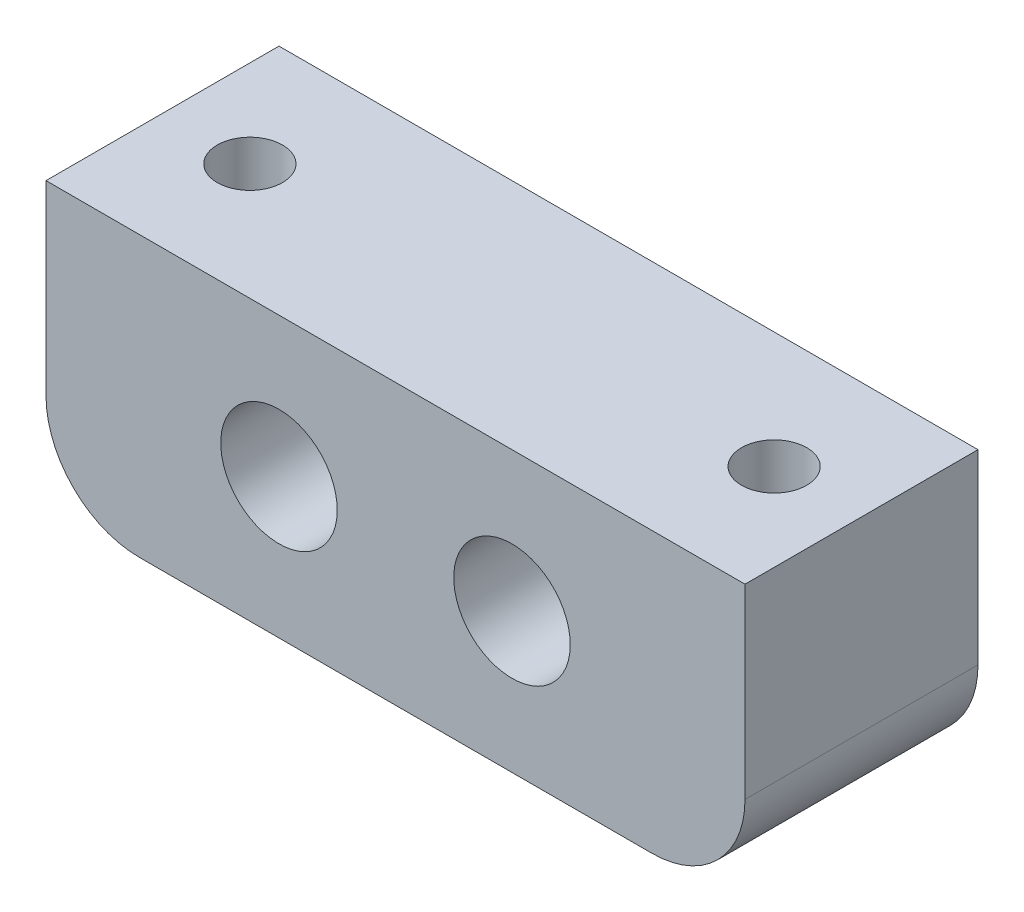
ISO-10303-21;
HEADER;
FILE_DESCRIPTION(('STEP AP214'),'2;1');
FILE_NAME('part.step','',(''),(''),'','','');
FILE_SCHEMA(('AUTOMOTIVE_DESIGN { 1 0 10303 214 1 1 1 1 }'));
ENDSEC;
DATA;
#1=APPLICATION_CONTEXT('core data for automotive mechanical design processes');
#2=APPLICATION_PROTOCOL_DEFINITION('international standard','automotive_design',2000,#1);
#3=PRODUCT_CONTEXT('',#1,'mechanical');
#4=PRODUCT('Part','Part','',(#3));
#5=PRODUCT_RELATED_PRODUCT_CATEGORY('part','',(#4));
#6=PRODUCT_DEFINITION_FORMATION('','',#4);
#7=PRODUCT_DEFINITION_CONTEXT('part definition',#1,'design');
#8=PRODUCT_DEFINITION('design','',#6,#7);
#9=PRODUCT_DEFINITION_SHAPE('','',#8);
#10=(LENGTH_UNIT() NAMED_UNIT(*) SI_UNIT(.MILLI.,.METRE.));
#11=(NAMED_UNIT(*) PLANE_ANGLE_UNIT() SI_UNIT($,.RADIAN.));
#12=(NAMED_UNIT(*) SI_UNIT($,.STERADIAN.) SOLID_ANGLE_UNIT());
#13=UNCERTAINTY_MEASURE_WITH_UNIT(LENGTH_MEASURE(1.E-05),#10,'distance_accuracy_value','');
#14=(GEOMETRIC_REPRESENTATION_CONTEXT(3) GLOBAL_UNCERTAINTY_ASSIGNED_CONTEXT((#13)) GLOBAL_UNIT_ASSIGNED_CONTEXT((#10,
#11,#12)) REPRESENTATION_CONTEXT('',''));
#15=CARTESIAN_POINT('',(0.,0.,0.));
#16=DIRECTION('',(0.,0.,1.));
#17=DIRECTION('',(1.,0.,0.));
#18=AXIS2_PLACEMENT_3D('',#15,#16,#17);
#19=CARTESIAN_POINT('',(-3.65320491734623,-5.17350013380129,6.35));
#20=DIRECTION('',(0.,0.,1.));
#21=DIRECTION('',(1.,0.,0.));
#22=AXIS2_PLACEMENT_3D('',#19,#20,#21);
#23=PLANE('',#22);
#24=CARTESIAN_POINT('',(0.15679508265377,-3.90350013380129,6.35));
#25=DIRECTION('',(0.,0.,1.));
#26=DIRECTION('',(1.,0.,0.));
#27=AXIS2_PLACEMENT_3D('',#24,#25,#26);
#28=CIRCLE('',#27,1.5875);
#29=CARTESIAN_POINT('',(1.74429508265377,-3.90350013380129,6.35));
#30=VERTEX_POINT('',#29);
#31=EDGE_CURVE('E122',#30,#30,#28,.T.);
#32=ORIENTED_EDGE('',*,*,#31,.F.);
#33=EDGE_LOOP('',(#32));
#34=FACE_BOUND('',#33,.T.);
#35=DIRECTION('',(0.,-1.,0.));
#36=VECTOR('',#35,1.);
#37=CARTESIAN_POINT('',(-6.19320491734623,-0.0935001338012867,6.35));
#38=LINE('',#37,#36);
#39=CARTESIAN_POINT('',(-6.19320491734623,-0.0935001338012867,6.35));
#40=VERTEX_POINT('',#39);
#41=CARTESIAN_POINT('',(-6.19320491734623,-5.17350013380127,6.35));
#42=VERTEX_POINT('',#41);
#43=EDGE_CURVE('E129',#40,#42,#38,.T.);
#44=ORIENTED_EDGE('',*,*,#43,.T.);
#45=CARTESIAN_POINT('',(-3.65320491734623,-5.17350013380129,6.35));
#46=DIRECTION('',(0.,0.,1.));
#47=DIRECTION('',(1.,0.,0.));
#48=AXIS2_PLACEMENT_3D('',#45,#46,#47);
#49=CIRCLE('',#48,2.54);
#50=CARTESIAN_POINT('',(-3.65320491734621,-7.71350013380129,6.35));
#51=VERTEX_POINT('',#50);
#52=EDGE_CURVE('E87',#42,#51,#49,.T.);
#53=ORIENTED_EDGE('',*,*,#52,.T.);
#54=DIRECTION('',(1.,0.,0.));
#55=VECTOR('',#54,1.);
#56=CARTESIAN_POINT('',(-3.65320491734621,-7.71350013380129,6.35));
#57=LINE('',#56,#55);
#58=CARTESIAN_POINT('',(10.3167950826538,-7.71350013380129,6.35));
#59=VERTEX_POINT('',#58);
#60=EDGE_CURVE('E100',#51,#59,#57,.T.);
#61=ORIENTED_EDGE('',*,*,#60,.T.);
#62=CARTESIAN_POINT('',(10.3167950826538,-5.17350013380129,6.35));
#63=DIRECTION('',(0.,0.,1.));
#64=DIRECTION('',(1.,0.,0.));
#65=AXIS2_PLACEMENT_3D('',#62,#63,#64);
#66=CIRCLE('',#65,2.54);
#67=CARTESIAN_POINT('',(12.8567950826538,-5.17350013380127,6.35));
#68=VERTEX_POINT('',#67);
#69=EDGE_CURVE('E94',#59,#68,#66,.T.);
#70=ORIENTED_EDGE('',*,*,#69,.T.);
#71=DIRECTION('',(0.,1.,0.));
#72=VECTOR('',#71,1.);
#73=CARTESIAN_POINT('',(12.8567950826538,-0.0935001338012876,6.35));
#74=LINE('',#73,#72);
#75=CARTESIAN_POINT('',(12.8567950826538,-0.0935001338012876,6.35));
#76=VERTEX_POINT('',#75);
#77=EDGE_CURVE('E98',#68,#76,#74,.T.);
#78=ORIENTED_EDGE('',*,*,#77,.T.);
#79=DIRECTION('',(-1.,0.,0.));
#80=VECTOR('',#79,1.);
#81=CARTESIAN_POINT('',(-6.19320491734623,-0.0935001338012867,6.35));
#82=LINE('',#81,#80);
#83=EDGE_CURVE('E50',#76,#40,#82,.T.);
#84=ORIENTED_EDGE('',*,*,#83,.T.);
#85=EDGE_LOOP('',(#44,#53,#61,#70,#78,#84));
#86=FACE_BOUND('',#85,.T.);
#87=CARTESIAN_POINT('',(6.50679508265377,-3.90350013380129,6.35));
#88=DIRECTION('',(0.,0.,1.));
#89=DIRECTION('',(1.,0.,0.));
#90=AXIS2_PLACEMENT_3D('',#87,#88,#89);
#91=CIRCLE('',#90,1.5875);
#92=CARTESIAN_POINT('',(8.09429508265377,-3.90350013380129,6.35));
#93=VERTEX_POINT('',#92);
#94=EDGE_CURVE('E203',#93,#93,#91,.T.);
#95=ORIENTED_EDGE('',*,*,#94,.F.);
#96=EDGE_LOOP('',(#95));
#97=FACE_BOUND('',#96,.T.);
#98=ADVANCED_FACE('F33',(#34,#86,#97),#23,.T.);
#99=CARTESIAN_POINT('',(-3.65320491734623,-5.17350013380129,0.));
#100=DIRECTION('',(0.,0.,1.));
#101=DIRECTION('',(1.,0.,0.));
#102=AXIS2_PLACEMENT_3D('',#99,#100,#101);
#103=PLANE('',#102);
#104=CARTESIAN_POINT('',(0.15679508265377,-3.90350013380129,0.));
#105=DIRECTION('',(0.,0.,1.));
#106=DIRECTION('',(1.,0.,0.));
#107=AXIS2_PLACEMENT_3D('',#104,#105,#106);
#108=CIRCLE('',#107,1.5875);
#109=CARTESIAN_POINT('',(1.74429508265377,-3.90350013380129,0.));
#110=VERTEX_POINT('',#109);
#111=EDGE_CURVE('E206',#110,#110,#108,.T.);
#112=ORIENTED_EDGE('',*,*,#111,.T.);
#113=EDGE_LOOP('',(#112));
#114=FACE_BOUND('',#113,.T.);
#115=DIRECTION('',(0.,-1.,0.));
#116=VECTOR('',#115,1.);
#117=CARTESIAN_POINT('',(-6.19320491734623,-0.0935001338012867,0.));
#118=LINE('',#117,#116);
#119=CARTESIAN_POINT('',(-6.19320491734623,-0.0935001338012867,0.));
#120=VERTEX_POINT('',#119);
#121=CARTESIAN_POINT('',(-6.19320491734623,-5.17350013380127,0.));
#122=VERTEX_POINT('',#121);
#123=EDGE_CURVE('E118',#120,#122,#118,.T.);
#124=ORIENTED_EDGE('',*,*,#123,.F.);
#125=DIRECTION('',(-1.,0.,0.));
#126=VECTOR('',#125,1.);
#127=CARTESIAN_POINT('',(-6.19320491734623,-0.0935001338012867,0.));
#128=LINE('',#127,#126);
#129=CARTESIAN_POINT('',(12.8567950826538,-0.0935001338012876,0.));
#130=VERTEX_POINT('',#129);
#131=EDGE_CURVE('E79',#130,#120,#128,.T.);
#132=ORIENTED_EDGE('',*,*,#131,.F.);
#133=DIRECTION('',(0.,1.,0.));
#134=VECTOR('',#133,1.);
#135=CARTESIAN_POINT('',(12.8567950826538,-0.0935001338012876,0.));
#136=LINE('',#135,#134);
#137=CARTESIAN_POINT('',(12.8567950826538,-5.17350013380127,0.));
#138=VERTEX_POINT('',#137);
#139=EDGE_CURVE('E73',#138,#130,#136,.T.);
#140=ORIENTED_EDGE('',*,*,#139,.F.);
#141=CARTESIAN_POINT('',(10.3167950826538,-5.17350013380129,0.));
#142=DIRECTION('',(0.,0.,1.));
#143=DIRECTION('',(1.,0.,0.));
#144=AXIS2_PLACEMENT_3D('',#141,#142,#143);
#145=CIRCLE('',#144,2.54);
#146=CARTESIAN_POINT('',(10.3167950826538,-7.71350013380129,0.));
#147=VERTEX_POINT('',#146);
#148=EDGE_CURVE('E108',#147,#138,#145,.T.);
#149=ORIENTED_EDGE('',*,*,#148,.F.);
#150=DIRECTION('',(1.,0.,0.));
#151=VECTOR('',#150,1.);
#152=CARTESIAN_POINT('',(-3.65320491734621,-7.71350013380129,0.));
#153=LINE('',#152,#151);
#154=CARTESIAN_POINT('',(-3.65320491734621,-7.71350013380129,0.));
#155=VERTEX_POINT('',#154);
#156=EDGE_CURVE('E124',#155,#147,#153,.T.);
#157=ORIENTED_EDGE('',*,*,#156,.F.);
#158=CARTESIAN_POINT('',(-3.65320491734623,-5.17350013380129,0.));
#159=DIRECTION('',(0.,0.,1.));
#160=DIRECTION('',(1.,0.,0.));
#161=AXIS2_PLACEMENT_3D('',#158,#159,#160);
#162=CIRCLE('',#161,2.54);
#163=EDGE_CURVE('E121',#122,#155,#162,.T.);
#164=ORIENTED_EDGE('',*,*,#163,.F.);
#165=EDGE_LOOP('',(#124,#132,#140,#149,#157,#164));
#166=FACE_BOUND('',#165,.T.);
#167=CARTESIAN_POINT('',(6.50679508265377,-3.90350013380129,0.));
#168=DIRECTION('',(0.,0.,1.));
#169=DIRECTION('',(1.,0.,0.));
#170=AXIS2_PLACEMENT_3D('',#167,#168,#169);
#171=CIRCLE('',#170,1.5875);
#172=CARTESIAN_POINT('',(8.09429508265377,-3.90350013380129,0.));
#173=VERTEX_POINT('',#172);
#174=EDGE_CURVE('E201',#173,#173,#171,.T.);
#175=ORIENTED_EDGE('',*,*,#174,.T.);
#176=EDGE_LOOP('',(#175));
#177=FACE_BOUND('',#176,.T.);
#178=ADVANCED_FACE('F138',(#114,#166,#177),#103,.F.);
#179=CARTESIAN_POINT('',(-6.19320491734623,-0.0935001338012867,6.35));
#180=DIRECTION('',(1.,0.,0.));
#181=DIRECTION('',(0.,1.,0.));
#182=AXIS2_PLACEMENT_3D('',#179,#180,#181);
#183=PLANE('',#182);
#184=ORIENTED_EDGE('',*,*,#123,.T.);
#185=DIRECTION('',(0.,0.,-1.));
#186=VECTOR('',#185,1.);
#187=CARTESIAN_POINT('',(-6.19320491734623,-5.17350013380127,6.35));
#188=LINE('',#187,#186);
#189=EDGE_CURVE('E11',#42,#122,#188,.T.);
#190=ORIENTED_EDGE('',*,*,#189,.F.);
#191=ORIENTED_EDGE('',*,*,#43,.F.);
#192=DIRECTION('',(0.,0.,-1.));
#193=VECTOR('',#192,1.);
#194=CARTESIAN_POINT('',(-6.19320491734623,-0.0935001338012867,6.35));
#195=LINE('',#194,#193);
#196=EDGE_CURVE('E114',#40,#120,#195,.T.);
#197=ORIENTED_EDGE('',*,*,#196,.T.);
#198=EDGE_LOOP('',(#184,#190,#191,#197));
#199=FACE_BOUND('',#198,.T.);
#200=ADVANCED_FACE('F35',(#199),#183,.F.);
#201=CARTESIAN_POINT('',(-3.65320491734623,-5.17350013380129,6.35));
#202=DIRECTION('',(0.,0.,-1.));
#203=DIRECTION('',(-1.,0.,0.));
#204=AXIS2_PLACEMENT_3D('',#201,#202,#203);
#205=CYLINDRICAL_SURFACE('',#204,2.54);
#206=ORIENTED_EDGE('',*,*,#163,.T.);
#207=DIRECTION('',(0.,0.,-1.));
#208=VECTOR('',#207,1.);
#209=CARTESIAN_POINT('',(-3.65320491734621,-7.71350013380129,6.35));
#210=LINE('',#209,#208);
#211=EDGE_CURVE('E42',#51,#155,#210,.T.);
#212=ORIENTED_EDGE('',*,*,#211,.F.);
#213=ORIENTED_EDGE('',*,*,#52,.F.);
#214=ORIENTED_EDGE('',*,*,#189,.T.);
#215=EDGE_LOOP('',(#206,#212,#213,#214));
#216=FACE_BOUND('',#215,.T.);
#217=ADVANCED_FACE('F267',(#216),#205,.T.);
#218=CARTESIAN_POINT('',(-3.65320491734621,-7.71350013380129,6.35));
#219=DIRECTION('',(0.,1.,0.));
#220=DIRECTION('',(0.,0.,1.));
#221=AXIS2_PLACEMENT_3D('',#218,#219,#220);
#222=PLANE('',#221);
#223=ORIENTED_EDGE('',*,*,#156,.T.);
#224=DIRECTION('',(0.,0.,-1.));
#225=VECTOR('',#224,1.);
#226=CARTESIAN_POINT('',(10.3167950826538,-7.71350013380129,6.35));
#227=LINE('',#226,#225);
#228=EDGE_CURVE('E109',#59,#147,#227,.T.);
#229=ORIENTED_EDGE('',*,*,#228,.F.);
#230=ORIENTED_EDGE('',*,*,#60,.F.);
#231=ORIENTED_EDGE('',*,*,#211,.T.);
#232=EDGE_LOOP('',(#223,#229,#230,#231));
#233=FACE_BOUND('',#232,.T.);
#234=ADVANCED_FACE('F135',(#233),#222,.F.);
#235=CARTESIAN_POINT('',(10.3167950826538,-5.17350013380129,6.35));
#236=DIRECTION('',(0.,0.,-1.));
#237=DIRECTION('',(-1.,0.,0.));
#238=AXIS2_PLACEMENT_3D('',#235,#236,#237);
#239=CYLINDRICAL_SURFACE('',#238,2.54);
#240=ORIENTED_EDGE('',*,*,#148,.T.);
#241=DIRECTION('',(0.,0.,-1.));
#242=VECTOR('',#241,1.);
#243=CARTESIAN_POINT('',(12.8567950826538,-5.17350013380127,6.35));
#244=LINE('',#243,#242);
#245=EDGE_CURVE('E105',#68,#138,#244,.T.);
#246=ORIENTED_EDGE('',*,*,#245,.F.);
#247=ORIENTED_EDGE('',*,*,#69,.F.);
#248=ORIENTED_EDGE('',*,*,#228,.T.);
#249=EDGE_LOOP('',(#240,#246,#247,#248));
#250=FACE_BOUND('',#249,.T.);
#251=ADVANCED_FACE('F106',(#250),#239,.T.);
#252=CARTESIAN_POINT('',(12.8567950826538,-0.0935001338012876,6.35));
#253=DIRECTION('',(-1.,0.,0.));
#254=DIRECTION('',(0.,-1.,0.));
#255=AXIS2_PLACEMENT_3D('',#252,#253,#254);
#256=PLANE('',#255);
#257=ORIENTED_EDGE('',*,*,#139,.T.);
#258=DIRECTION('',(0.,0.,-1.));
#259=VECTOR('',#258,1.);
#260=CARTESIAN_POINT('',(12.8567950826538,-0.0935001338012876,6.35));
#261=LINE('',#260,#259);
#262=EDGE_CURVE('E110',#76,#130,#261,.T.);
#263=ORIENTED_EDGE('',*,*,#262,.F.);
#264=ORIENTED_EDGE('',*,*,#77,.F.);
#265=ORIENTED_EDGE('',*,*,#245,.T.);
#266=EDGE_LOOP('',(#257,#263,#264,#265));
#267=FACE_BOUND('',#266,.T.);
#268=ADVANCED_FACE('F112',(#267),#256,.F.);
#269=CARTESIAN_POINT('',(-6.19320491734623,-0.0935001338012867,6.35));
#270=DIRECTION('',(0.,-1.,0.));
#271=DIRECTION('',(1.,0.,0.));
#272=AXIS2_PLACEMENT_3D('',#269,#270,#271);
#273=PLANE('',#272);
#274=CARTESIAN_POINT('',(10.4755450826538,-0.0935001338012875,3.175));
#275=DIRECTION('',(0.,1.,0.));
#276=DIRECTION('',(-1.,0.,0.));
#277=AXIS2_PLACEMENT_3D('',#274,#275,#276);
#278=CIRCLE('',#277,0.889000000000002);
#279=CARTESIAN_POINT('',(9.58654508265377,-0.0935001338012874,3.175));
#280=VERTEX_POINT('',#279);
#281=EDGE_CURVE('E192',#280,#280,#278,.T.);
#282=ORIENTED_EDGE('',*,*,#281,.F.);
#283=EDGE_LOOP('',(#282));
#284=FACE_BOUND('',#283,.T.);
#285=CARTESIAN_POINT('',(-3.81195491734623,-0.0935001338012868,3.175));
#286=DIRECTION('',(0.,1.,0.));
#287=DIRECTION('',(-1.,0.,0.));
#288=AXIS2_PLACEMENT_3D('',#285,#286,#287);
#289=CIRCLE('',#288,0.889);
#290=CARTESIAN_POINT('',(-4.70095491734623,-0.0935001338012868,3.175));
#291=VERTEX_POINT('',#290);
#292=EDGE_CURVE('E191',#291,#291,#289,.T.);
#293=ORIENTED_EDGE('',*,*,#292,.F.);
#294=EDGE_LOOP('',(#293));
#295=FACE_BOUND('',#294,.T.);
#296=ORIENTED_EDGE('',*,*,#131,.T.);
#297=ORIENTED_EDGE('',*,*,#196,.F.);
#298=ORIENTED_EDGE('',*,*,#83,.F.);
#299=ORIENTED_EDGE('',*,*,#262,.T.);
#300=EDGE_LOOP('',(#296,#297,#298,#299));
#301=FACE_BOUND('',#300,.T.);
#302=ADVANCED_FACE('F143',(#284,#295,#301),#273,.F.);
#303=CARTESIAN_POINT('',(0.15679508265377,-3.90350013380129,6.35));
#304=DIRECTION('',(0.,0.,-1.));
#305=DIRECTION('',(-1.,0.,0.));
#306=AXIS2_PLACEMENT_3D('',#303,#304,#305);
#307=CYLINDRICAL_SURFACE('',#306,1.5875);
#308=ORIENTED_EDGE('',*,*,#31,.T.);
#309=EDGE_LOOP('',(#308));
#310=FACE_BOUND('',#309,.T.);
#311=ORIENTED_EDGE('',*,*,#111,.F.);
#312=EDGE_LOOP('',(#311));
#313=FACE_BOUND('',#312,.T.);
#314=ADVANCED_FACE('F145',(#310,#313),#307,.F.);
#315=CARTESIAN_POINT('',(6.50679508265377,-3.90350013380129,6.35));
#316=DIRECTION('',(0.,0.,-1.));
#317=DIRECTION('',(-1.,0.,0.));
#318=AXIS2_PLACEMENT_3D('',#315,#316,#317);
#319=CYLINDRICAL_SURFACE('',#318,1.5875);
#320=ORIENTED_EDGE('',*,*,#94,.T.);
#321=EDGE_LOOP('',(#320));
#322=FACE_BOUND('',#321,.T.);
#323=ORIENTED_EDGE('',*,*,#174,.F.);
#324=EDGE_LOOP('',(#323));
#325=FACE_BOUND('',#324,.T.);
#326=ADVANCED_FACE('F152',(#322,#325),#319,.F.);
#327=CARTESIAN_POINT('',(-3.81195491734623,-6.44350013380129,3.175));
#328=DIRECTION('',(0.,1.,0.));
#329=DIRECTION('',(-1.,0.,0.));
#330=AXIS2_PLACEMENT_3D('',#327,#328,#329);
#331=CYLINDRICAL_SURFACE('',#330,0.889);
#332=CARTESIAN_POINT('',(-3.81195491734623,-6.44350013380129,3.175));
#333=DIRECTION('',(0.,1.,0.));
#334=DIRECTION('',(-1.,0.,0.));
#335=AXIS2_PLACEMENT_3D('',#332,#333,#334);
#336=CIRCLE('',#335,0.889);
#337=CARTESIAN_POINT('',(-4.70095491734623,-6.44350013380129,3.175));
#338=VERTEX_POINT('',#337);
#339=EDGE_CURVE('E195',#338,#338,#336,.T.);
#340=ORIENTED_EDGE('',*,*,#339,.F.);
#341=EDGE_LOOP('',(#340));
#342=FACE_BOUND('',#341,.T.);
#343=ORIENTED_EDGE('',*,*,#292,.T.);
#344=EDGE_LOOP('',(#343));
#345=FACE_BOUND('',#344,.T.);
#346=ADVANCED_FACE('F170',(#342,#345),#331,.F.);
#347=CARTESIAN_POINT('',(-3.81195491734623,-6.44350013380129,3.175));
#348=DIRECTION('',(0.,1.,0.));
#349=DIRECTION('',(-1.,0.,0.));
#350=AXIS2_PLACEMENT_3D('',#347,#348,#349);
#351=PLANE('',#350);
#352=ORIENTED_EDGE('',*,*,#339,.T.);
#353=EDGE_LOOP('',(#352));
#354=FACE_BOUND('',#353,.T.);
#355=ADVANCED_FACE('F174',(#354),#351,.T.);
#356=CARTESIAN_POINT('',(10.4755450826538,-6.44350013380129,3.175));
#357=DIRECTION('',(0.,1.,0.));
#358=DIRECTION('',(-1.,0.,0.));
#359=AXIS2_PLACEMENT_3D('',#356,#357,#358);
#360=CYLINDRICAL_SURFACE('',#359,0.889000000000002);
#361=CARTESIAN_POINT('',(10.4755450826538,-6.44350013380129,3.175));
#362=DIRECTION('',(0.,1.,0.));
#363=DIRECTION('',(-1.,0.,0.));
#364=AXIS2_PLACEMENT_3D('',#361,#362,#363);
#365=CIRCLE('',#364,0.889000000000002);
#366=CARTESIAN_POINT('',(9.58654508265377,-6.44350013380129,3.175));
#367=VERTEX_POINT('',#366);
#368=EDGE_CURVE('E190',#367,#367,#365,.T.);
#369=ORIENTED_EDGE('',*,*,#368,.F.);
#370=EDGE_LOOP('',(#369));
#371=FACE_BOUND('',#370,.T.);
#372=ORIENTED_EDGE('',*,*,#281,.T.);
#373=EDGE_LOOP('',(#372));
#374=FACE_BOUND('',#373,.T.);
#375=ADVANCED_FACE('F178',(#371,#374),#360,.F.);
#376=CARTESIAN_POINT('',(10.4755450826538,-6.44350013380129,3.175));
#377=DIRECTION('',(0.,1.,0.));
#378=DIRECTION('',(-1.,0.,0.));
#379=AXIS2_PLACEMENT_3D('',#376,#377,#378);
#380=PLANE('',#379);
#381=ORIENTED_EDGE('',*,*,#368,.T.);
#382=EDGE_LOOP('',(#381));
#383=FACE_BOUND('',#382,.T.);
#384=ADVANCED_FACE('F182',(#383),#380,.T.);
#385=CLOSED_SHELL('',(#98,#178,#200,#217,#234,#251,#268,#302,#314,#326,#346,#355,#375,#384));
#386=MANIFOLD_SOLID_BREP('B2',#385);
#387=ADVANCED_BREP_SHAPE_REPRESENTATION('',(#18,#386),#14);
#388=SHAPE_DEFINITION_REPRESENTATION(#9,#387);
ENDSEC;
END-ISO-10303-21;
